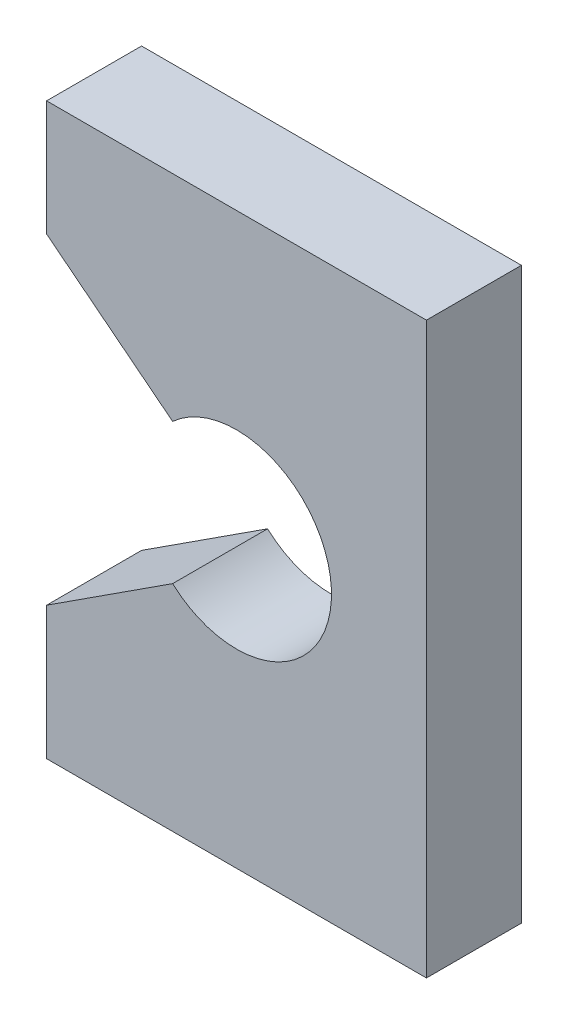
ISO-10303-21;
HEADER;
FILE_DESCRIPTION(('STEP AP214'),'2;1');
FILE_NAME('part.step','',(''),(''),'','','');
FILE_SCHEMA(('AUTOMOTIVE_DESIGN { 1 0 10303 214 1 1 1 1 }'));
ENDSEC;
DATA;
#1=APPLICATION_CONTEXT('core data for automotive mechanical design processes');
#2=APPLICATION_PROTOCOL_DEFINITION('international standard','automotive_design',2000,#1);
#3=PRODUCT_CONTEXT('',#1,'mechanical');
#4=PRODUCT('Part','Part','',(#3));
#5=PRODUCT_RELATED_PRODUCT_CATEGORY('part','',(#4));
#6=PRODUCT_DEFINITION_FORMATION('','',#4);
#7=PRODUCT_DEFINITION_CONTEXT('part definition',#1,'design');
#8=PRODUCT_DEFINITION('design','',#6,#7);
#9=PRODUCT_DEFINITION_SHAPE('','',#8);
#10=(LENGTH_UNIT() NAMED_UNIT(*) SI_UNIT(.MILLI.,.METRE.));
#11=(NAMED_UNIT(*) PLANE_ANGLE_UNIT() SI_UNIT($,.RADIAN.));
#12=(NAMED_UNIT(*) SI_UNIT($,.STERADIAN.) SOLID_ANGLE_UNIT());
#13=UNCERTAINTY_MEASURE_WITH_UNIT(LENGTH_MEASURE(1.E-05),#10,'distance_accuracy_value','');
#14=(GEOMETRIC_REPRESENTATION_CONTEXT(3) GLOBAL_UNCERTAINTY_ASSIGNED_CONTEXT((#13)) GLOBAL_UNIT_ASSIGNED_CONTEXT((#10,
#11,#12)) REPRESENTATION_CONTEXT('',''));
#15=CARTESIAN_POINT('',(0.,0.,0.));
#16=DIRECTION('',(0.,0.,1.));
#17=DIRECTION('',(1.,0.,0.));
#18=AXIS2_PLACEMENT_3D('',#15,#16,#17);
#19=CARTESIAN_POINT('',(-10.,8.92503792418479,5.));
#20=DIRECTION('',(0.618788332961587,0.785557762987942,0.));
#21=DIRECTION('',(-0.785557762987942,0.618788332961587,0.));
#22=AXIS2_PLACEMENT_3D('',#19,#20,#21);
#23=PLANE('',#22);
#24=DIRECTION('',(0.785557762987942,-0.618788332961587,0.));
#25=VECTOR('',#24,1.);
#26=CARTESIAN_POINT('',(-10.,8.92503792418479,0.));
#27=LINE('',#26,#25);
#28=CARTESIAN_POINT('',(-10.,8.92503792418479,0.));
#29=VERTEX_POINT('',#28);
#30=CARTESIAN_POINT('',(-3.36476545373873,3.69842580584313,0.));
#31=VERTEX_POINT('',#30);
#32=EDGE_CURVE('E138',#29,#31,#27,.T.);
#33=ORIENTED_EDGE('',*,*,#32,.T.);
#34=DIRECTION('',(0.,0.,-1.));
#35=VECTOR('',#34,1.);
#36=CARTESIAN_POINT('',(-3.36476545373873,3.69842580584313,5.));
#37=LINE('',#36,#35);
#38=CARTESIAN_POINT('',(-3.36476545373873,3.69842580584313,5.));
#39=VERTEX_POINT('',#38);
#40=EDGE_CURVE('E11',#39,#31,#37,.T.);
#41=ORIENTED_EDGE('',*,*,#40,.F.);
#42=DIRECTION('',(0.785557762987942,-0.618788332961587,0.));
#43=VECTOR('',#42,1.);
#44=CARTESIAN_POINT('',(-10.,8.92503792418479,5.));
#45=LINE('',#44,#43);
#46=CARTESIAN_POINT('',(-10.,8.92503792418479,5.));
#47=VERTEX_POINT('',#46);
#48=EDGE_CURVE('E164',#47,#39,#45,.T.);
#49=ORIENTED_EDGE('',*,*,#48,.F.);
#50=DIRECTION('',(0.,0.,-1.));
#51=VECTOR('',#50,1.);
#52=CARTESIAN_POINT('',(-10.,8.92503792418479,5.));
#53=LINE('',#52,#51);
#54=EDGE_CURVE('E134',#47,#29,#53,.T.);
#55=ORIENTED_EDGE('',*,*,#54,.T.);
#56=EDGE_LOOP('',(#33,#41,#49,#55));
#57=FACE_BOUND('',#56,.T.);
#58=ADVANCED_FACE('F39',(#57),#23,.F.);
#59=CARTESIAN_POINT('',(0.,0.,5.));
#60=DIRECTION('',(0.,0.,-1.));
#61=DIRECTION('',(-1.,0.,0.));
#62=AXIS2_PLACEMENT_3D('',#59,#60,#61);
#63=CYLINDRICAL_SURFACE('',#62,5.);
#64=CARTESIAN_POINT('',(0.,0.,0.));
#65=DIRECTION('',(0.,0.,-1.));
#66=DIRECTION('',(-1.,0.,0.));
#67=AXIS2_PLACEMENT_3D('',#64,#65,#66);
#68=CIRCLE('',#67,5.);
#69=CARTESIAN_POINT('',(-3.36476545373873,-3.69842580584313,0.));
#70=VERTEX_POINT('',#69);
#71=EDGE_CURVE('E142',#31,#70,#68,.T.);
#72=ORIENTED_EDGE('',*,*,#71,.T.);
#73=DIRECTION('',(0.,0.,-1.));
#74=VECTOR('',#73,1.);
#75=CARTESIAN_POINT('',(-3.36476545373873,-3.69842580584313,5.));
#76=LINE('',#75,#74);
#77=CARTESIAN_POINT('',(-3.36476545373873,-3.69842580584313,5.));
#78=VERTEX_POINT('',#77);
#79=EDGE_CURVE('E48',#78,#70,#76,.T.);
#80=ORIENTED_EDGE('',*,*,#79,.F.);
#81=CARTESIAN_POINT('',(0.,0.,5.));
#82=DIRECTION('',(0.,0.,-1.));
#83=DIRECTION('',(-1.,0.,0.));
#84=AXIS2_PLACEMENT_3D('',#81,#82,#83);
#85=CIRCLE('',#84,5.);
#86=EDGE_CURVE('E95',#39,#78,#85,.T.);
#87=ORIENTED_EDGE('',*,*,#86,.F.);
#88=ORIENTED_EDGE('',*,*,#40,.T.);
#89=EDGE_LOOP('',(#72,#80,#87,#88));
#90=FACE_BOUND('',#89,.T.);
#91=ADVANCED_FACE('F184',(#90),#63,.F.);
#92=CARTESIAN_POINT('',(-10.,-8.,5.));
#93=DIRECTION('',(-0.543980870023785,0.839097618306813,0.));
#94=DIRECTION('',(-0.839097618306813,-0.543980870023785,0.));
#95=AXIS2_PLACEMENT_3D('',#92,#93,#94);
#96=PLANE('',#95);
#97=DIRECTION('',(0.839097618306813,0.543980870023785,0.));
#98=VECTOR('',#97,1.);
#99=CARTESIAN_POINT('',(-10.,-8.,0.));
#100=LINE('',#99,#98);
#101=CARTESIAN_POINT('',(-10.,-8.,0.));
#102=VERTEX_POINT('',#101);
#103=EDGE_CURVE('E146',#102,#70,#100,.T.);
#104=ORIENTED_EDGE('',*,*,#103,.F.);
#105=DIRECTION('',(0.,0.,-1.));
#106=VECTOR('',#105,1.);
#107=CARTESIAN_POINT('',(-10.,-8.,5.));
#108=LINE('',#107,#106);
#109=CARTESIAN_POINT('',(-10.,-8.,5.));
#110=VERTEX_POINT('',#109);
#111=EDGE_CURVE('E175',#110,#102,#108,.T.);
#112=ORIENTED_EDGE('',*,*,#111,.F.);
#113=DIRECTION('',(0.839097618306813,0.543980870023785,0.));
#114=VECTOR('',#113,1.);
#115=CARTESIAN_POINT('',(-10.,-8.,5.));
#116=LINE('',#115,#114);
#117=EDGE_CURVE('E183',#110,#78,#116,.T.);
#118=ORIENTED_EDGE('',*,*,#117,.T.);
#119=ORIENTED_EDGE('',*,*,#79,.T.);
#120=EDGE_LOOP('',(#104,#112,#118,#119));
#121=FACE_BOUND('',#120,.T.);
#122=ADVANCED_FACE('F181',(#121),#96,.T.);
#123=CARTESIAN_POINT('',(-10.,-8.,5.));
#124=DIRECTION('',(1.,0.,0.));
#125=DIRECTION('',(0.,0.,-1.));
#126=AXIS2_PLACEMENT_3D('',#123,#124,#125);
#127=PLANE('',#126);
#128=DIRECTION('',(0.,-1.,0.));
#129=VECTOR('',#128,1.);
#130=CARTESIAN_POINT('',(-10.,-8.,0.));
#131=LINE('',#130,#129);
#132=CARTESIAN_POINT('',(-10.,-15.,0.));
#133=VERTEX_POINT('',#132);
#134=EDGE_CURVE('E150',#102,#133,#131,.T.);
#135=ORIENTED_EDGE('',*,*,#134,.T.);
#136=DIRECTION('',(0.,0.,-1.));
#137=VECTOR('',#136,1.);
#138=CARTESIAN_POINT('',(-10.,-15.,5.));
#139=LINE('',#138,#137);
#140=CARTESIAN_POINT('',(-10.,-15.,5.));
#141=VERTEX_POINT('',#140);
#142=EDGE_CURVE('E171',#141,#133,#139,.T.);
#143=ORIENTED_EDGE('',*,*,#142,.F.);
#144=DIRECTION('',(0.,-1.,0.));
#145=VECTOR('',#144,1.);
#146=CARTESIAN_POINT('',(-10.,-8.,5.));
#147=LINE('',#146,#145);
#148=EDGE_CURVE('E198',#110,#141,#147,.T.);
#149=ORIENTED_EDGE('',*,*,#148,.F.);
#150=ORIENTED_EDGE('',*,*,#111,.T.);
#151=EDGE_LOOP('',(#135,#143,#149,#150));
#152=FACE_BOUND('',#151,.T.);
#153=ADVANCED_FACE('F193',(#152),#127,.F.);
#154=CARTESIAN_POINT('',(-10.,-15.,5.));
#155=DIRECTION('',(0.,1.,0.));
#156=DIRECTION('',(0.,0.,1.));
#157=AXIS2_PLACEMENT_3D('',#154,#155,#156);
#158=PLANE('',#157);
#159=DIRECTION('',(1.,0.,0.));
#160=VECTOR('',#159,1.);
#161=CARTESIAN_POINT('',(-10.,-15.,0.));
#162=LINE('',#161,#160);
#163=CARTESIAN_POINT('',(10.,-15.,0.));
#164=VERTEX_POINT('',#163);
#165=EDGE_CURVE('E153',#133,#164,#162,.T.);
#166=ORIENTED_EDGE('',*,*,#165,.T.);
#167=DIRECTION('',(0.,0.,-1.));
#168=VECTOR('',#167,1.);
#169=CARTESIAN_POINT('',(10.,-15.,5.));
#170=LINE('',#169,#168);
#171=CARTESIAN_POINT('',(10.,-15.,5.));
#172=VERTEX_POINT('',#171);
#173=EDGE_CURVE('E121',#172,#164,#170,.T.);
#174=ORIENTED_EDGE('',*,*,#173,.F.);
#175=DIRECTION('',(1.,0.,0.));
#176=VECTOR('',#175,1.);
#177=CARTESIAN_POINT('',(-10.,-15.,5.));
#178=LINE('',#177,#176);
#179=EDGE_CURVE('E126',#141,#172,#178,.T.);
#180=ORIENTED_EDGE('',*,*,#179,.F.);
#181=ORIENTED_EDGE('',*,*,#142,.T.);
#182=EDGE_LOOP('',(#166,#174,#180,#181));
#183=FACE_BOUND('',#182,.T.);
#184=ADVANCED_FACE('F196',(#183),#158,.F.);
#185=CARTESIAN_POINT('',(10.,15.,5.));
#186=DIRECTION('',(1.,0.,0.));
#187=DIRECTION('',(0.,1.,0.));
#188=AXIS2_PLACEMENT_3D('',#185,#186,#187);
#189=PLANE('',#188);
#190=DIRECTION('',(0.,-1.,0.));
#191=VECTOR('',#190,1.);
#192=CARTESIAN_POINT('',(10.,15.,0.));
#193=LINE('',#192,#191);
#194=CARTESIAN_POINT('',(10.,15.,0.));
#195=VERTEX_POINT('',#194);
#196=EDGE_CURVE('E115',#195,#164,#193,.T.);
#197=ORIENTED_EDGE('',*,*,#196,.F.);
#198=DIRECTION('',(0.,0.,-1.));
#199=VECTOR('',#198,1.);
#200=CARTESIAN_POINT('',(10.,15.,5.));
#201=LINE('',#200,#199);
#202=CARTESIAN_POINT('',(10.,15.,5.));
#203=VERTEX_POINT('',#202);
#204=EDGE_CURVE('E110',#203,#195,#201,.T.);
#205=ORIENTED_EDGE('',*,*,#204,.F.);
#206=DIRECTION('',(0.,-1.,0.));
#207=VECTOR('',#206,1.);
#208=CARTESIAN_POINT('',(10.,15.,5.));
#209=LINE('',#208,#207);
#210=EDGE_CURVE('E113',#203,#172,#209,.T.);
#211=ORIENTED_EDGE('',*,*,#210,.T.);
#212=ORIENTED_EDGE('',*,*,#173,.T.);
#213=EDGE_LOOP('',(#197,#205,#211,#212));
#214=FACE_BOUND('',#213,.T.);
#215=ADVANCED_FACE('F112',(#214),#189,.T.);
#216=CARTESIAN_POINT('',(-10.,15.,5.));
#217=DIRECTION('',(0.,1.,0.));
#218=DIRECTION('',(0.,0.,1.));
#219=AXIS2_PLACEMENT_3D('',#216,#217,#218);
#220=PLANE('',#219);
#221=DIRECTION('',(1.,0.,0.));
#222=VECTOR('',#221,1.);
#223=CARTESIAN_POINT('',(-10.,15.,0.));
#224=LINE('',#223,#222);
#225=CARTESIAN_POINT('',(-10.,15.,0.));
#226=VERTEX_POINT('',#225);
#227=EDGE_CURVE('E159',#226,#195,#224,.T.);
#228=ORIENTED_EDGE('',*,*,#227,.F.);
#229=DIRECTION('',(0.,0.,-1.));
#230=VECTOR('',#229,1.);
#231=CARTESIAN_POINT('',(-10.,15.,5.));
#232=LINE('',#231,#230);
#233=CARTESIAN_POINT('',(-10.,15.,5.));
#234=VERTEX_POINT('',#233);
#235=EDGE_CURVE('E84',#234,#226,#232,.T.);
#236=ORIENTED_EDGE('',*,*,#235,.F.);
#237=DIRECTION('',(1.,0.,0.));
#238=VECTOR('',#237,1.);
#239=CARTESIAN_POINT('',(-10.,15.,5.));
#240=LINE('',#239,#238);
#241=EDGE_CURVE('E124',#234,#203,#240,.T.);
#242=ORIENTED_EDGE('',*,*,#241,.T.);
#243=ORIENTED_EDGE('',*,*,#204,.T.);
#244=EDGE_LOOP('',(#228,#236,#242,#243));
#245=FACE_BOUND('',#244,.T.);
#246=ADVANCED_FACE('F130',(#245),#220,.T.);
#247=CARTESIAN_POINT('',(-10.,15.,5.));
#248=DIRECTION('',(1.,0.,0.));
#249=DIRECTION('',(0.,1.,0.));
#250=AXIS2_PLACEMENT_3D('',#247,#248,#249);
#251=PLANE('',#250);
#252=DIRECTION('',(0.,-1.,0.));
#253=VECTOR('',#252,1.);
#254=CARTESIAN_POINT('',(-10.,15.,0.));
#255=LINE('',#254,#253);
#256=EDGE_CURVE('E87',#226,#29,#255,.T.);
#257=ORIENTED_EDGE('',*,*,#256,.T.);
#258=ORIENTED_EDGE('',*,*,#54,.F.);
#259=DIRECTION('',(0.,-1.,0.));
#260=VECTOR('',#259,1.);
#261=CARTESIAN_POINT('',(-10.,15.,5.));
#262=LINE('',#261,#260);
#263=EDGE_CURVE('E56',#234,#47,#262,.T.);
#264=ORIENTED_EDGE('',*,*,#263,.F.);
#265=ORIENTED_EDGE('',*,*,#235,.T.);
#266=EDGE_LOOP('',(#257,#258,#264,#265));
#267=FACE_BOUND('',#266,.T.);
#268=ADVANCED_FACE('F209',(#267),#251,.F.);
#269=CARTESIAN_POINT('',(0.,0.,5.));
#270=DIRECTION('',(0.,0.,-1.));
#271=DIRECTION('',(-1.,0.,0.));
#272=AXIS2_PLACEMENT_3D('',#269,#270,#271);
#273=PLANE('',#272);
#274=ORIENTED_EDGE('',*,*,#48,.T.);
#275=ORIENTED_EDGE('',*,*,#86,.T.);
#276=ORIENTED_EDGE('',*,*,#117,.F.);
#277=ORIENTED_EDGE('',*,*,#148,.T.);
#278=ORIENTED_EDGE('',*,*,#179,.T.);
#279=ORIENTED_EDGE('',*,*,#210,.F.);
#280=ORIENTED_EDGE('',*,*,#241,.F.);
#281=ORIENTED_EDGE('',*,*,#263,.T.);
#282=EDGE_LOOP('',(#274,#275,#276,#277,#278,#279,#280,#281));
#283=FACE_BOUND('',#282,.T.);
#284=ADVANCED_FACE('F123',(#283),#273,.F.);
#285=CARTESIAN_POINT('',(0.,0.,0.));
#286=DIRECTION('',(0.,0.,-1.));
#287=DIRECTION('',(-1.,0.,0.));
#288=AXIS2_PLACEMENT_3D('',#285,#286,#287);
#289=PLANE('',#288);
#290=ORIENTED_EDGE('',*,*,#32,.F.);
#291=ORIENTED_EDGE('',*,*,#256,.F.);
#292=ORIENTED_EDGE('',*,*,#227,.T.);
#293=ORIENTED_EDGE('',*,*,#196,.T.);
#294=ORIENTED_EDGE('',*,*,#165,.F.);
#295=ORIENTED_EDGE('',*,*,#134,.F.);
#296=ORIENTED_EDGE('',*,*,#103,.T.);
#297=ORIENTED_EDGE('',*,*,#71,.F.);
#298=EDGE_LOOP('',(#290,#291,#292,#293,#294,#295,#296,#297));
#299=FACE_BOUND('',#298,.T.);
#300=ADVANCED_FACE('F189',(#299),#289,.T.);
#301=CLOSED_SHELL('',(#58,#91,#122,#153,#184,#215,#246,#268,#284,#300));
#302=MANIFOLD_SOLID_BREP('B2',#301);
#303=ADVANCED_BREP_SHAPE_REPRESENTATION('',(#18,#302),#14);
#304=SHAPE_DEFINITION_REPRESENTATION(#9,#303);
ENDSEC;
END-ISO-10303-21;
